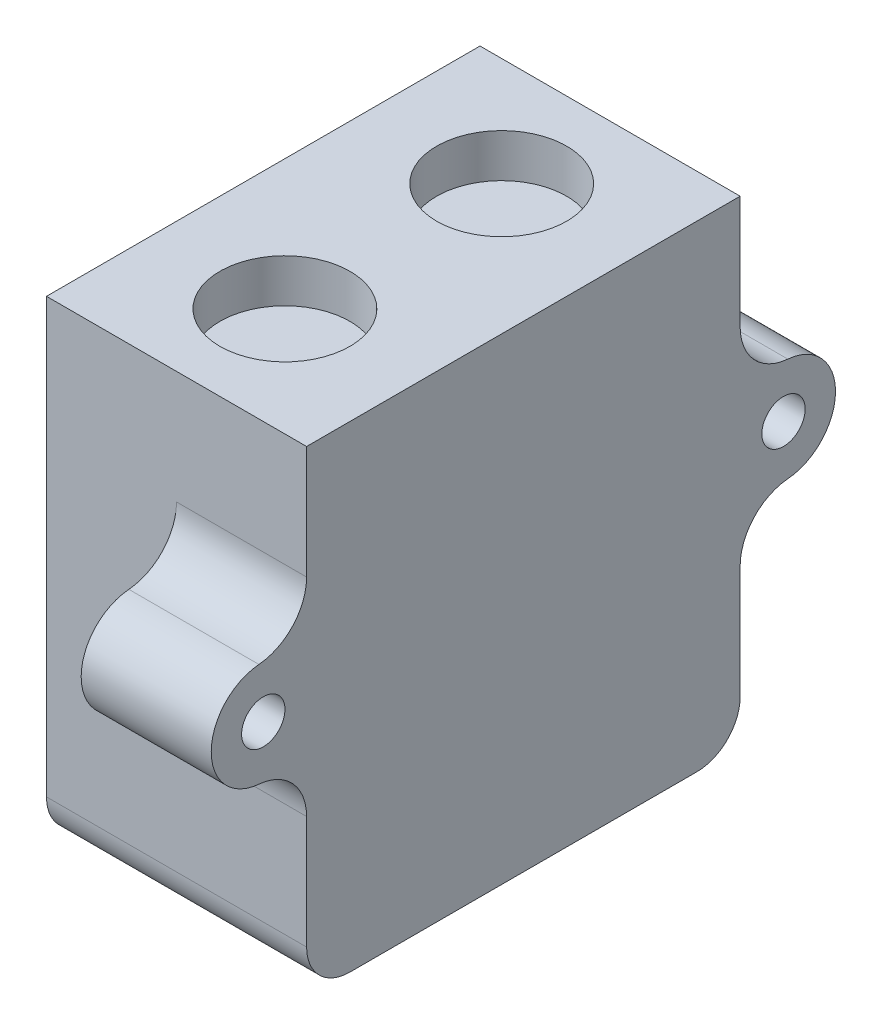
ISO-10303-21;
HEADER;
FILE_DESCRIPTION(('STEP AP214'),'2;1');
FILE_NAME('part.step','',(''),(''),'','','');
FILE_SCHEMA(('AUTOMOTIVE_DESIGN { 1 0 10303 214 1 1 1 1 }'));
ENDSEC;
DATA;
#1=APPLICATION_CONTEXT('core data for automotive mechanical design processes');
#2=APPLICATION_PROTOCOL_DEFINITION('international standard','automotive_design',2000,#1);
#3=PRODUCT_CONTEXT('',#1,'mechanical');
#4=PRODUCT('Part','Part','',(#3));
#5=PRODUCT_RELATED_PRODUCT_CATEGORY('part','',(#4));
#6=PRODUCT_DEFINITION_FORMATION('','',#4);
#7=PRODUCT_DEFINITION_CONTEXT('part definition',#1,'design');
#8=PRODUCT_DEFINITION('design','',#6,#7);
#9=PRODUCT_DEFINITION_SHAPE('','',#8);
#10=(LENGTH_UNIT() NAMED_UNIT(*) SI_UNIT(.MILLI.,.METRE.));
#11=(NAMED_UNIT(*) PLANE_ANGLE_UNIT() SI_UNIT($,.RADIAN.));
#12=(NAMED_UNIT(*) SI_UNIT($,.STERADIAN.) SOLID_ANGLE_UNIT());
#13=UNCERTAINTY_MEASURE_WITH_UNIT(LENGTH_MEASURE(1.E-05),#10,'distance_accuracy_value','');
#14=(GEOMETRIC_REPRESENTATION_CONTEXT(3) GLOBAL_UNCERTAINTY_ASSIGNED_CONTEXT((#13)) GLOBAL_UNIT_ASSIGNED_CONTEXT((#10,
#11,#12)) REPRESENTATION_CONTEXT('',''));
#15=CARTESIAN_POINT('',(0.,0.,0.));
#16=DIRECTION('',(0.,0.,1.));
#17=DIRECTION('',(1.,0.,0.));
#18=AXIS2_PLACEMENT_3D('',#15,#16,#17);
#19=CARTESIAN_POINT('',(60.,50.,50.));
#20=DIRECTION('',(0.,0.,-1.));
#21=DIRECTION('',(-1.,0.,0.));
#22=AXIS2_PLACEMENT_3D('',#19,#20,#21);
#23=PLANE('',#22);
#24=DIRECTION('',(0.,-1.,0.));
#25=VECTOR('',#24,1.);
#26=CARTESIAN_POINT('',(60.,50.,50.));
#27=LINE('',#26,#25);
#28=CARTESIAN_POINT('',(60.,-13.9165214862028,50.));
#29=VERTEX_POINT('',#28);
#30=CARTESIAN_POINT('',(60.,-40.,50.));
#31=VERTEX_POINT('',#30);
#32=EDGE_CURVE('E249',#29,#31,#27,.T.);
#33=ORIENTED_EDGE('',*,*,#32,.F.);
#34=DIRECTION('',(1.,0.,0.));
#35=VECTOR('',#34,1.);
#36=CARTESIAN_POINT('',(30.,-13.9165214862028,50.));
#37=LINE('',#36,#35);
#38=CARTESIAN_POINT('',(30.,-13.9165214862028,50.));
#39=VERTEX_POINT('',#38);
#40=EDGE_CURVE('E200',#39,#29,#37,.T.);
#41=ORIENTED_EDGE('',*,*,#40,.F.);
#42=DIRECTION('',(0.,1.,0.));
#43=VECTOR('',#42,1.);
#44=CARTESIAN_POINT('',(30.,33.9165214862028,50.));
#45=LINE('',#44,#43);
#46=CARTESIAN_POINT('',(30.,33.9165214862028,50.));
#47=VERTEX_POINT('',#46);
#48=EDGE_CURVE('E190',#39,#47,#45,.T.);
#49=ORIENTED_EDGE('',*,*,#48,.T.);
#50=DIRECTION('',(1.,0.,0.));
#51=VECTOR('',#50,1.);
#52=CARTESIAN_POINT('',(30.,33.9165214862028,50.));
#53=LINE('',#52,#51);
#54=CARTESIAN_POINT('',(60.,33.9165214862028,50.));
#55=VERTEX_POINT('',#54);
#56=EDGE_CURVE('E211',#47,#55,#53,.T.);
#57=ORIENTED_EDGE('',*,*,#56,.T.);
#58=CARTESIAN_POINT('',(60.,60.,50.));
#59=VERTEX_POINT('',#58);
#60=EDGE_CURVE('E245',#59,#55,#27,.T.);
#61=ORIENTED_EDGE('',*,*,#60,.F.);
#62=DIRECTION('',(1.,0.,0.));
#63=VECTOR('',#62,1.);
#64=CARTESIAN_POINT('',(60.,60.,50.));
#65=LINE('',#64,#63);
#66=CARTESIAN_POINT('',(0.,60.,50.));
#67=VERTEX_POINT('',#66);
#68=EDGE_CURVE('E229',#67,#59,#65,.T.);
#69=ORIENTED_EDGE('',*,*,#68,.F.);
#70=DIRECTION('',(0.,-1.,0.));
#71=VECTOR('',#70,1.);
#72=CARTESIAN_POINT('',(0.,50.,50.));
#73=LINE('',#72,#71);
#74=CARTESIAN_POINT('',(0.,-40.,50.));
#75=VERTEX_POINT('',#74);
#76=EDGE_CURVE('E242',#67,#75,#73,.T.);
#77=ORIENTED_EDGE('',*,*,#76,.T.);
#78=DIRECTION('',(-1.,0.,0.));
#79=VECTOR('',#78,1.);
#80=CARTESIAN_POINT('',(60.,-40.,50.));
#81=LINE('',#80,#79);
#82=EDGE_CURVE('E272',#75,#31,#81,.F.);
#83=ORIENTED_EDGE('',*,*,#82,.T.);
#84=EDGE_LOOP('',(#33,#41,#49,#57,#61,#69,#77,#83));
#85=FACE_BOUND('',#84,.T.);
#86=ADVANCED_FACE('F39',(#85),#23,.F.);
#87=CARTESIAN_POINT('',(60.,-50.,50.));
#88=DIRECTION('',(0.,1.,0.));
#89=DIRECTION('',(0.,0.,1.));
#90=AXIS2_PLACEMENT_3D('',#87,#88,#89);
#91=PLANE('',#90);
#92=DIRECTION('',(0.,0.,-1.));
#93=VECTOR('',#92,1.);
#94=CARTESIAN_POINT('',(60.,-50.,50.));
#95=LINE('',#94,#93);
#96=CARTESIAN_POINT('',(60.,-50.,40.));
#97=VERTEX_POINT('',#96);
#98=CARTESIAN_POINT('',(60.,-50.,-40.));
#99=VERTEX_POINT('',#98);
#100=EDGE_CURVE('E248',#97,#99,#95,.T.);
#101=ORIENTED_EDGE('',*,*,#100,.F.);
#102=DIRECTION('',(-1.,0.,0.));
#103=VECTOR('',#102,1.);
#104=CARTESIAN_POINT('',(60.,-50.,40.));
#105=LINE('',#104,#103);
#106=CARTESIAN_POINT('',(0.,-50.,40.));
#107=VERTEX_POINT('',#106);
#108=EDGE_CURVE('E265',#97,#107,#105,.T.);
#109=ORIENTED_EDGE('',*,*,#108,.T.);
#110=DIRECTION('',(0.,0.,-1.));
#111=VECTOR('',#110,1.);
#112=CARTESIAN_POINT('',(0.,-50.,50.));
#113=LINE('',#112,#111);
#114=CARTESIAN_POINT('',(0.,-50.,-40.));
#115=VERTEX_POINT('',#114);
#116=EDGE_CURVE('E259',#107,#115,#113,.T.);
#117=ORIENTED_EDGE('',*,*,#116,.T.);
#118=DIRECTION('',(-1.,0.,0.));
#119=VECTOR('',#118,1.);
#120=CARTESIAN_POINT('',(60.,-50.,-40.));
#121=LINE('',#120,#119);
#122=EDGE_CURVE('E256',#115,#99,#121,.F.);
#123=ORIENTED_EDGE('',*,*,#122,.T.);
#124=EDGE_LOOP('',(#101,#109,#117,#123));
#125=FACE_BOUND('',#124,.T.);
#126=ADVANCED_FACE('F286',(#125),#91,.F.);
#127=CARTESIAN_POINT('',(60.,50.,-50.));
#128=DIRECTION('',(0.,0.,1.));
#129=DIRECTION('',(1.,0.,0.));
#130=AXIS2_PLACEMENT_3D('',#127,#128,#129);
#131=PLANE('',#130);
#132=DIRECTION('',(0.,1.,0.));
#133=VECTOR('',#132,1.);
#134=CARTESIAN_POINT('',(30.,33.9165214862028,-50.));
#135=LINE('',#134,#133);
#136=CARTESIAN_POINT('',(30.,-13.9165214862028,-50.));
#137=VERTEX_POINT('',#136);
#138=CARTESIAN_POINT('',(30.,33.9165214862028,-50.));
#139=VERTEX_POINT('',#138);
#140=EDGE_CURVE('E159',#137,#139,#135,.T.);
#141=ORIENTED_EDGE('',*,*,#140,.F.);
#142=DIRECTION('',(1.,0.,0.));
#143=VECTOR('',#142,1.);
#144=CARTESIAN_POINT('',(30.,-13.9165214862028,-50.));
#145=LINE('',#144,#143);
#146=CARTESIAN_POINT('',(60.,-13.9165214862028,-50.));
#147=VERTEX_POINT('',#146);
#148=EDGE_CURVE('E163',#137,#147,#145,.T.);
#149=ORIENTED_EDGE('',*,*,#148,.T.);
#150=DIRECTION('',(0.,1.,0.));
#151=VECTOR('',#150,1.);
#152=CARTESIAN_POINT('',(60.,50.,-50.));
#153=LINE('',#152,#151);
#154=CARTESIAN_POINT('',(60.,-40.,-50.));
#155=VERTEX_POINT('',#154);
#156=EDGE_CURVE('E253',#155,#147,#153,.T.);
#157=ORIENTED_EDGE('',*,*,#156,.F.);
#158=DIRECTION('',(-1.,0.,0.));
#159=VECTOR('',#158,1.);
#160=CARTESIAN_POINT('',(60.,-40.,-50.));
#161=LINE('',#160,#159);
#162=CARTESIAN_POINT('',(0.,-40.,-50.));
#163=VERTEX_POINT('',#162);
#164=EDGE_CURVE('E11',#155,#163,#161,.T.);
#165=ORIENTED_EDGE('',*,*,#164,.T.);
#166=DIRECTION('',(0.,1.,0.));
#167=VECTOR('',#166,1.);
#168=CARTESIAN_POINT('',(0.,50.,-50.));
#169=LINE('',#168,#167);
#170=CARTESIAN_POINT('',(0.,60.,-50.));
#171=VERTEX_POINT('',#170);
#172=EDGE_CURVE('E262',#163,#171,#169,.T.);
#173=ORIENTED_EDGE('',*,*,#172,.T.);
#174=DIRECTION('',(-1.,0.,0.));
#175=VECTOR('',#174,1.);
#176=CARTESIAN_POINT('',(60.,60.,-50.));
#177=LINE('',#176,#175);
#178=CARTESIAN_POINT('',(60.,60.,-50.));
#179=VERTEX_POINT('',#178);
#180=EDGE_CURVE('E235',#179,#171,#177,.T.);
#181=ORIENTED_EDGE('',*,*,#180,.F.);
#182=CARTESIAN_POINT('',(60.,33.9165214862028,-50.));
#183=VERTEX_POINT('',#182);
#184=EDGE_CURVE('E252',#183,#179,#153,.T.);
#185=ORIENTED_EDGE('',*,*,#184,.F.);
#186=DIRECTION('',(1.,0.,0.));
#187=VECTOR('',#186,1.);
#188=CARTESIAN_POINT('',(30.,33.9165214862028,-50.));
#189=LINE('',#188,#187);
#190=EDGE_CURVE('E179',#139,#183,#189,.T.);
#191=ORIENTED_EDGE('',*,*,#190,.F.);
#192=EDGE_LOOP('',(#141,#149,#157,#165,#173,#181,#185,#191));
#193=FACE_BOUND('',#192,.T.);
#194=ADVANCED_FACE('F302',(#193),#131,.F.);
#195=CARTESIAN_POINT('',(60.,0.,0.));
#196=DIRECTION('',(-1.,0.,0.));
#197=DIRECTION('',(0.,0.,1.));
#198=AXIS2_PLACEMENT_3D('',#195,#196,#197);
#199=PLANE('',#198);
#200=ORIENTED_EDGE('',*,*,#60,.T.);
#201=CARTESIAN_POINT('',(60.,33.9165214862028,62.));
#202=DIRECTION('',(-1.,0.,0.));
#203=DIRECTION('',(0.,0.,-1.));
#204=AXIS2_PLACEMENT_3D('',#201,#202,#203);
#205=CIRCLE('',#204,12.);
#206=CARTESIAN_POINT('',(60.,21.9582607431014,61.));
#207=VERTEX_POINT('',#206);
#208=EDGE_CURVE('E202',#55,#207,#205,.T.);
#209=ORIENTED_EDGE('',*,*,#208,.T.);
#210=CARTESIAN_POINT('',(60.,10.,60.));
#211=DIRECTION('',(1.,0.,0.));
#212=DIRECTION('',(0.,0.,1.));
#213=AXIS2_PLACEMENT_3D('',#210,#211,#212);
#214=CIRCLE('',#213,12.);
#215=CARTESIAN_POINT('',(60.,-1.95826074310139,61.));
#216=VERTEX_POINT('',#215);
#217=EDGE_CURVE('E191',#207,#216,#214,.T.);
#218=ORIENTED_EDGE('',*,*,#217,.T.);
#219=CARTESIAN_POINT('',(60.,-13.9165214862028,62.));
#220=DIRECTION('',(-1.,0.,0.));
#221=DIRECTION('',(0.,0.,-1.));
#222=AXIS2_PLACEMENT_3D('',#219,#220,#221);
#223=CIRCLE('',#222,12.);
#224=EDGE_CURVE('E61',#216,#29,#223,.T.);
#225=ORIENTED_EDGE('',*,*,#224,.T.);
#226=ORIENTED_EDGE('',*,*,#32,.T.);
#227=CARTESIAN_POINT('',(60.,-40.,40.));
#228=DIRECTION('',(-1.,0.,0.));
#229=DIRECTION('',(0.,0.,1.));
#230=AXIS2_PLACEMENT_3D('',#227,#228,#229);
#231=CIRCLE('',#230,10.);
#232=EDGE_CURVE('E47',#31,#97,#231,.F.);
#233=ORIENTED_EDGE('',*,*,#232,.T.);
#234=ORIENTED_EDGE('',*,*,#100,.T.);
#235=CARTESIAN_POINT('',(60.,-40.,-40.));
#236=DIRECTION('',(-1.,0.,0.));
#237=DIRECTION('',(0.,0.,1.));
#238=AXIS2_PLACEMENT_3D('',#235,#236,#237);
#239=CIRCLE('',#238,10.);
#240=EDGE_CURVE('E275',#99,#155,#239,.F.);
#241=ORIENTED_EDGE('',*,*,#240,.T.);
#242=ORIENTED_EDGE('',*,*,#156,.T.);
#243=CARTESIAN_POINT('',(60.,-13.9165214862028,-62.));
#244=DIRECTION('',(1.,0.,0.));
#245=DIRECTION('',(0.,0.,1.));
#246=AXIS2_PLACEMENT_3D('',#243,#244,#245);
#247=CIRCLE('',#246,12.);
#248=CARTESIAN_POINT('',(60.,-1.95826074310139,-61.));
#249=VERTEX_POINT('',#248);
#250=EDGE_CURVE('E173',#249,#147,#247,.T.);
#251=ORIENTED_EDGE('',*,*,#250,.F.);
#252=CARTESIAN_POINT('',(60.,10.,-60.));
#253=DIRECTION('',(-1.,0.,0.));
#254=DIRECTION('',(0.,0.,-1.));
#255=AXIS2_PLACEMENT_3D('',#252,#253,#254);
#256=CIRCLE('',#255,12.);
#257=CARTESIAN_POINT('',(60.,21.9582607431014,-61.));
#258=VERTEX_POINT('',#257);
#259=EDGE_CURVE('E155',#258,#249,#256,.T.);
#260=ORIENTED_EDGE('',*,*,#259,.F.);
#261=CARTESIAN_POINT('',(60.,33.9165214862028,-62.));
#262=DIRECTION('',(1.,0.,0.));
#263=DIRECTION('',(0.,0.,1.));
#264=AXIS2_PLACEMENT_3D('',#261,#262,#263);
#265=CIRCLE('',#264,12.);
#266=EDGE_CURVE('E54',#183,#258,#265,.T.);
#267=ORIENTED_EDGE('',*,*,#266,.F.);
#268=ORIENTED_EDGE('',*,*,#184,.T.);
#269=DIRECTION('',(0.,0.,-1.));
#270=VECTOR('',#269,1.);
#271=CARTESIAN_POINT('',(60.,60.,-50.));
#272=LINE('',#271,#270);
#273=EDGE_CURVE('E232',#59,#179,#272,.T.);
#274=ORIENTED_EDGE('',*,*,#273,.F.);
#275=EDGE_LOOP('',(#200,#209,#218,#225,#226,#233,#234,#241,#242,#251,#260,#267,#268,#274));
#276=FACE_BOUND('',#275,.T.);
#277=CARTESIAN_POINT('',(60.,10.,60.));
#278=DIRECTION('',(1.,0.,0.));
#279=DIRECTION('',(0.,0.,-1.));
#280=AXIS2_PLACEMENT_3D('',#277,#278,#279);
#281=CIRCLE('',#280,5.);
#282=CARTESIAN_POINT('',(60.,10.,55.));
#283=VERTEX_POINT('',#282);
#284=EDGE_CURVE('E178',#283,#283,#281,.T.);
#285=ORIENTED_EDGE('',*,*,#284,.F.);
#286=EDGE_LOOP('',(#285));
#287=FACE_BOUND('',#286,.T.);
#288=CARTESIAN_POINT('',(60.,10.,-60.));
#289=DIRECTION('',(-1.,0.,0.));
#290=DIRECTION('',(0.,0.,1.));
#291=AXIS2_PLACEMENT_3D('',#288,#289,#290);
#292=CIRCLE('',#291,5.);
#293=CARTESIAN_POINT('',(60.,10.,-55.));
#294=VERTEX_POINT('',#293);
#295=EDGE_CURVE('E168',#294,#294,#292,.T.);
#296=ORIENTED_EDGE('',*,*,#295,.T.);
#297=EDGE_LOOP('',(#296));
#298=FACE_BOUND('',#297,.T.);
#299=ADVANCED_FACE('F278',(#276,#287,#298),#199,.F.);
#300=CARTESIAN_POINT('',(0.,0.,0.));
#301=DIRECTION('',(-1.,0.,0.));
#302=DIRECTION('',(0.,0.,1.));
#303=AXIS2_PLACEMENT_3D('',#300,#301,#302);
#304=PLANE('',#303);
#305=CARTESIAN_POINT('',(0.,0.,0.));
#306=DIRECTION('',(-1.,0.,0.));
#307=DIRECTION('',(0.,0.,1.));
#308=AXIS2_PLACEMENT_3D('',#305,#306,#307);
#309=CIRCLE('',#308,31.);
#310=CARTESIAN_POINT('',(0.,0.,31.));
#311=VERTEX_POINT('',#310);
#312=EDGE_CURVE('E238',#311,#311,#309,.T.);
#313=ORIENTED_EDGE('',*,*,#312,.F.);
#314=EDGE_LOOP('',(#313));
#315=FACE_BOUND('',#314,.T.);
#316=ORIENTED_EDGE('',*,*,#116,.F.);
#317=CARTESIAN_POINT('',(0.,-40.,40.));
#318=DIRECTION('',(-1.,0.,0.));
#319=DIRECTION('',(0.,0.,1.));
#320=AXIS2_PLACEMENT_3D('',#317,#318,#319);
#321=CIRCLE('',#320,10.);
#322=EDGE_CURVE('E270',#107,#75,#321,.T.);
#323=ORIENTED_EDGE('',*,*,#322,.T.);
#324=ORIENTED_EDGE('',*,*,#76,.F.);
#325=DIRECTION('',(0.,0.,1.));
#326=VECTOR('',#325,1.);
#327=CARTESIAN_POINT('',(0.,60.,-50.));
#328=LINE('',#327,#326);
#329=EDGE_CURVE('E224',#171,#67,#328,.T.);
#330=ORIENTED_EDGE('',*,*,#329,.F.);
#331=ORIENTED_EDGE('',*,*,#172,.F.);
#332=CARTESIAN_POINT('',(0.,-40.,-40.));
#333=DIRECTION('',(-1.,0.,0.));
#334=DIRECTION('',(0.,0.,1.));
#335=AXIS2_PLACEMENT_3D('',#332,#333,#334);
#336=CIRCLE('',#335,10.);
#337=EDGE_CURVE('E268',#163,#115,#336,.T.);
#338=ORIENTED_EDGE('',*,*,#337,.T.);
#339=EDGE_LOOP('',(#316,#323,#324,#330,#331,#338));
#340=FACE_BOUND('',#339,.T.);
#341=ADVANCED_FACE('F291',(#315,#340),#304,.T.);
#342=CARTESIAN_POINT('',(30.,0.,0.));
#343=DIRECTION('',(-1.,0.,0.));
#344=DIRECTION('',(0.,0.,1.));
#345=AXIS2_PLACEMENT_3D('',#342,#343,#344);
#346=CYLINDRICAL_SURFACE('',#345,31.);
#347=CARTESIAN_POINT('',(30.,0.,0.));
#348=DIRECTION('',(-1.,0.,0.));
#349=DIRECTION('',(0.,0.,1.));
#350=AXIS2_PLACEMENT_3D('',#347,#348,#349);
#351=CIRCLE('',#350,31.);
#352=CARTESIAN_POINT('',(30.,0.,31.));
#353=VERTEX_POINT('',#352);
#354=EDGE_CURVE('E239',#353,#353,#351,.T.);
#355=ORIENTED_EDGE('',*,*,#354,.F.);
#356=EDGE_LOOP('',(#355));
#357=FACE_BOUND('',#356,.T.);
#358=ORIENTED_EDGE('',*,*,#312,.T.);
#359=EDGE_LOOP('',(#358));
#360=FACE_BOUND('',#359,.T.);
#361=ADVANCED_FACE('F355',(#357,#360),#346,.F.);
#362=CARTESIAN_POINT('',(30.,0.,0.));
#363=DIRECTION('',(-1.,0.,0.));
#364=DIRECTION('',(0.,0.,1.));
#365=AXIS2_PLACEMENT_3D('',#362,#363,#364);
#366=PLANE('',#365);
#367=ORIENTED_EDGE('',*,*,#354,.T.);
#368=EDGE_LOOP('',(#367));
#369=FACE_BOUND('',#368,.T.);
#370=ADVANCED_FACE('F350',(#369),#366,.T.);
#371=CARTESIAN_POINT('',(60.,-40.,40.));
#372=DIRECTION('',(-1.,0.,0.));
#373=DIRECTION('',(0.,0.,1.));
#374=AXIS2_PLACEMENT_3D('',#371,#372,#373);
#375=CYLINDRICAL_SURFACE('',#374,10.);
#376=ORIENTED_EDGE('',*,*,#232,.F.);
#377=ORIENTED_EDGE('',*,*,#82,.F.);
#378=ORIENTED_EDGE('',*,*,#322,.F.);
#379=ORIENTED_EDGE('',*,*,#108,.F.);
#380=EDGE_LOOP('',(#376,#377,#378,#379));
#381=FACE_BOUND('',#380,.T.);
#382=ADVANCED_FACE('F289',(#381),#375,.T.);
#383=CARTESIAN_POINT('',(60.,-40.,-40.));
#384=DIRECTION('',(-1.,0.,0.));
#385=DIRECTION('',(0.,0.,1.));
#386=AXIS2_PLACEMENT_3D('',#383,#384,#385);
#387=CYLINDRICAL_SURFACE('',#386,10.);
#388=ORIENTED_EDGE('',*,*,#240,.F.);
#389=ORIENTED_EDGE('',*,*,#122,.F.);
#390=ORIENTED_EDGE('',*,*,#337,.F.);
#391=ORIENTED_EDGE('',*,*,#164,.F.);
#392=EDGE_LOOP('',(#388,#389,#390,#391));
#393=FACE_BOUND('',#392,.T.);
#394=ADVANCED_FACE('F41',(#393),#387,.T.);
#395=CARTESIAN_POINT('',(0.,60.,0.));
#396=DIRECTION('',(0.,-1.,0.));
#397=DIRECTION('',(0.,0.,-1.));
#398=AXIS2_PLACEMENT_3D('',#395,#396,#397);
#399=PLANE('',#398);
#400=ORIENTED_EDGE('',*,*,#329,.T.);
#401=ORIENTED_EDGE('',*,*,#68,.T.);
#402=ORIENTED_EDGE('',*,*,#273,.T.);
#403=ORIENTED_EDGE('',*,*,#180,.T.);
#404=EDGE_LOOP('',(#400,#401,#402,#403));
#405=FACE_BOUND('',#404,.T.);
#406=CARTESIAN_POINT('',(30.,60.,-25.));
#407=DIRECTION('',(0.,1.,0.));
#408=DIRECTION('',(0.,0.,1.));
#409=AXIS2_PLACEMENT_3D('',#406,#407,#408);
#410=CIRCLE('',#409,15.);
#411=CARTESIAN_POINT('',(30.,60.,-10.));
#412=VERTEX_POINT('',#411);
#413=EDGE_CURVE('E221',#412,#412,#410,.T.);
#414=ORIENTED_EDGE('',*,*,#413,.F.);
#415=EDGE_LOOP('',(#414));
#416=FACE_BOUND('',#415,.T.);
#417=CARTESIAN_POINT('',(30.,60.,25.));
#418=DIRECTION('',(0.,1.,0.));
#419=DIRECTION('',(0.,0.,1.));
#420=AXIS2_PLACEMENT_3D('',#417,#418,#419);
#421=CIRCLE('',#420,15.);
#422=CARTESIAN_POINT('',(30.,60.,40.));
#423=VERTEX_POINT('',#422);
#424=EDGE_CURVE('E215',#423,#423,#421,.T.);
#425=ORIENTED_EDGE('',*,*,#424,.F.);
#426=EDGE_LOOP('',(#425));
#427=FACE_BOUND('',#426,.T.);
#428=ADVANCED_FACE('F297',(#405,#416,#427),#399,.F.);
#429=CARTESIAN_POINT('',(30.,60.,-25.));
#430=DIRECTION('',(0.,-1.,0.));
#431=DIRECTION('',(0.,0.,-1.));
#432=AXIS2_PLACEMENT_3D('',#429,#430,#431);
#433=CYLINDRICAL_SURFACE('',#432,15.);
#434=ORIENTED_EDGE('',*,*,#413,.T.);
#435=EDGE_LOOP('',(#434));
#436=FACE_BOUND('',#435,.T.);
#437=CARTESIAN_POINT('',(30.,50.,-25.));
#438=DIRECTION('',(0.,1.,0.));
#439=DIRECTION('',(0.,0.,1.));
#440=AXIS2_PLACEMENT_3D('',#437,#438,#439);
#441=CIRCLE('',#440,15.);
#442=CARTESIAN_POINT('',(30.,50.,-10.));
#443=VERTEX_POINT('',#442);
#444=EDGE_CURVE('E218',#443,#443,#441,.T.);
#445=ORIENTED_EDGE('',*,*,#444,.F.);
#446=EDGE_LOOP('',(#445));
#447=FACE_BOUND('',#446,.T.);
#448=ADVANCED_FACE('F457',(#436,#447),#433,.F.);
#449=CARTESIAN_POINT('',(30.,60.,25.));
#450=DIRECTION('',(0.,-1.,0.));
#451=DIRECTION('',(0.,0.,-1.));
#452=AXIS2_PLACEMENT_3D('',#449,#450,#451);
#453=CYLINDRICAL_SURFACE('',#452,15.);
#454=ORIENTED_EDGE('',*,*,#424,.T.);
#455=EDGE_LOOP('',(#454));
#456=FACE_BOUND('',#455,.T.);
#457=CARTESIAN_POINT('',(30.,50.,25.));
#458=DIRECTION('',(0.,1.,0.));
#459=DIRECTION('',(0.,0.,1.));
#460=AXIS2_PLACEMENT_3D('',#457,#458,#459);
#461=CIRCLE('',#460,15.);
#462=CARTESIAN_POINT('',(30.,50.,40.));
#463=VERTEX_POINT('',#462);
#464=EDGE_CURVE('E208',#463,#463,#461,.T.);
#465=ORIENTED_EDGE('',*,*,#464,.F.);
#466=EDGE_LOOP('',(#465));
#467=FACE_BOUND('',#466,.T.);
#468=ADVANCED_FACE('F347',(#456,#467),#453,.F.);
#469=CARTESIAN_POINT('',(60.,50.,50.));
#470=DIRECTION('',(0.,-1.,0.));
#471=DIRECTION('',(0.,0.,-1.));
#472=AXIS2_PLACEMENT_3D('',#469,#470,#471);
#473=PLANE('',#472);
#474=ORIENTED_EDGE('',*,*,#444,.T.);
#475=EDGE_LOOP('',(#474));
#476=FACE_BOUND('',#475,.T.);
#477=ADVANCED_FACE('F344',(#476),#473,.F.);
#478=ORIENTED_EDGE('',*,*,#464,.T.);
#479=EDGE_LOOP('',(#478));
#480=FACE_BOUND('',#479,.T.);
#481=ADVANCED_FACE('F346',(#480),#473,.F.);
#482=CARTESIAN_POINT('',(30.,-13.9165214862028,62.));
#483=DIRECTION('',(1.,0.,0.));
#484=DIRECTION('',(0.,0.,-1.));
#485=AXIS2_PLACEMENT_3D('',#482,#483,#484);
#486=CYLINDRICAL_SURFACE('',#485,12.);
#487=ORIENTED_EDGE('',*,*,#224,.F.);
#488=DIRECTION('',(1.,0.,0.));
#489=VECTOR('',#488,1.);
#490=CARTESIAN_POINT('',(30.,-1.95826074310139,61.));
#491=LINE('',#490,#489);
#492=CARTESIAN_POINT('',(30.,-1.95826074310139,61.));
#493=VERTEX_POINT('',#492);
#494=EDGE_CURVE('E206',#493,#216,#491,.T.);
#495=ORIENTED_EDGE('',*,*,#494,.F.);
#496=CARTESIAN_POINT('',(30.,-13.9165214862028,62.));
#497=DIRECTION('',(-1.,0.,0.));
#498=DIRECTION('',(0.,0.,-1.));
#499=AXIS2_PLACEMENT_3D('',#496,#497,#498);
#500=CIRCLE('',#499,12.);
#501=EDGE_CURVE('E187',#493,#39,#500,.T.);
#502=ORIENTED_EDGE('',*,*,#501,.T.);
#503=ORIENTED_EDGE('',*,*,#40,.T.);
#504=EDGE_LOOP('',(#487,#495,#502,#503));
#505=FACE_BOUND('',#504,.T.);
#506=ADVANCED_FACE('F317',(#505),#486,.F.);
#507=CARTESIAN_POINT('',(30.,10.,60.));
#508=DIRECTION('',(1.,0.,0.));
#509=DIRECTION('',(0.,0.,-1.));
#510=AXIS2_PLACEMENT_3D('',#507,#508,#509);
#511=CYLINDRICAL_SURFACE('',#510,12.);
#512=ORIENTED_EDGE('',*,*,#217,.F.);
#513=DIRECTION('',(1.,0.,0.));
#514=VECTOR('',#513,1.);
#515=CARTESIAN_POINT('',(30.,21.9582607431014,61.));
#516=LINE('',#515,#514);
#517=CARTESIAN_POINT('',(30.,21.9582607431014,61.));
#518=VERTEX_POINT('',#517);
#519=EDGE_CURVE('E209',#518,#207,#516,.T.);
#520=ORIENTED_EDGE('',*,*,#519,.F.);
#521=CARTESIAN_POINT('',(30.,10.,60.));
#522=DIRECTION('',(1.,0.,0.));
#523=DIRECTION('',(0.,0.,1.));
#524=AXIS2_PLACEMENT_3D('',#521,#522,#523);
#525=CIRCLE('',#524,12.);
#526=EDGE_CURVE('E197',#518,#493,#525,.T.);
#527=ORIENTED_EDGE('',*,*,#526,.T.);
#528=ORIENTED_EDGE('',*,*,#494,.T.);
#529=EDGE_LOOP('',(#512,#520,#527,#528));
#530=FACE_BOUND('',#529,.T.);
#531=ADVANCED_FACE('F313',(#530),#511,.T.);
#532=CARTESIAN_POINT('',(30.,33.9165214862028,62.));
#533=DIRECTION('',(1.,0.,0.));
#534=DIRECTION('',(0.,0.,-1.));
#535=AXIS2_PLACEMENT_3D('',#532,#533,#534);
#536=CYLINDRICAL_SURFACE('',#535,12.);
#537=ORIENTED_EDGE('',*,*,#208,.F.);
#538=ORIENTED_EDGE('',*,*,#56,.F.);
#539=CARTESIAN_POINT('',(30.,33.9165214862028,62.));
#540=DIRECTION('',(-1.,0.,0.));
#541=DIRECTION('',(0.,0.,-1.));
#542=AXIS2_PLACEMENT_3D('',#539,#540,#541);
#543=CIRCLE('',#542,12.);
#544=EDGE_CURVE('E194',#47,#518,#543,.T.);
#545=ORIENTED_EDGE('',*,*,#544,.T.);
#546=ORIENTED_EDGE('',*,*,#519,.T.);
#547=EDGE_LOOP('',(#537,#538,#545,#546));
#548=FACE_BOUND('',#547,.T.);
#549=ADVANCED_FACE('F322',(#548),#536,.F.);
#550=CARTESIAN_POINT('',(30.,-13.9165214862028,62.));
#551=DIRECTION('',(1.,0.,0.));
#552=DIRECTION('',(0.,0.,-1.));
#553=AXIS2_PLACEMENT_3D('',#550,#551,#552);
#554=PLANE('',#553);
#555=CARTESIAN_POINT('',(30.,10.,60.));
#556=DIRECTION('',(1.,0.,0.));
#557=DIRECTION('',(0.,0.,-1.));
#558=AXIS2_PLACEMENT_3D('',#555,#556,#557);
#559=CIRCLE('',#558,5.);
#560=CARTESIAN_POINT('',(30.,10.,55.));
#561=VERTEX_POINT('',#560);
#562=EDGE_CURVE('E182',#561,#561,#559,.T.);
#563=ORIENTED_EDGE('',*,*,#562,.T.);
#564=EDGE_LOOP('',(#563));
#565=FACE_BOUND('',#564,.T.);
#566=ORIENTED_EDGE('',*,*,#501,.F.);
#567=ORIENTED_EDGE('',*,*,#526,.F.);
#568=ORIENTED_EDGE('',*,*,#544,.F.);
#569=ORIENTED_EDGE('',*,*,#48,.F.);
#570=EDGE_LOOP('',(#566,#567,#568,#569));
#571=FACE_BOUND('',#570,.T.);
#572=ADVANCED_FACE('F321',(#565,#571),#554,.F.);
#573=CARTESIAN_POINT('',(30.,10.,60.));
#574=DIRECTION('',(1.,0.,0.));
#575=DIRECTION('',(0.,0.,-1.));
#576=AXIS2_PLACEMENT_3D('',#573,#574,#575);
#577=CYLINDRICAL_SURFACE('',#576,5.);
#578=ORIENTED_EDGE('',*,*,#562,.F.);
#579=EDGE_LOOP('',(#578));
#580=FACE_BOUND('',#579,.T.);
#581=ORIENTED_EDGE('',*,*,#284,.T.);
#582=EDGE_LOOP('',(#581));
#583=FACE_BOUND('',#582,.T.);
#584=ADVANCED_FACE('F329',(#580,#583),#577,.F.);
#585=CARTESIAN_POINT('',(30.,-13.9165214862028,-62.));
#586=DIRECTION('',(1.,0.,0.));
#587=DIRECTION('',(0.,0.,1.));
#588=AXIS2_PLACEMENT_3D('',#585,#586,#587);
#589=PLANE('',#588);
#590=CARTESIAN_POINT('',(30.,-13.9165214862028,-62.));
#591=DIRECTION('',(1.,0.,0.));
#592=DIRECTION('',(0.,0.,1.));
#593=AXIS2_PLACEMENT_3D('',#590,#591,#592);
#594=CIRCLE('',#593,12.);
#595=CARTESIAN_POINT('',(30.,-1.95826074310139,-61.));
#596=VERTEX_POINT('',#595);
#597=EDGE_CURVE('E144',#596,#137,#594,.T.);
#598=ORIENTED_EDGE('',*,*,#597,.T.);
#599=ORIENTED_EDGE('',*,*,#140,.T.);
#600=CARTESIAN_POINT('',(30.,33.9165214862028,-62.));
#601=DIRECTION('',(1.,0.,0.));
#602=DIRECTION('',(0.,0.,1.));
#603=AXIS2_PLACEMENT_3D('',#600,#601,#602);
#604=CIRCLE('',#603,12.);
#605=CARTESIAN_POINT('',(30.,21.9582607431014,-61.));
#606=VERTEX_POINT('',#605);
#607=EDGE_CURVE('E147',#139,#606,#604,.T.);
#608=ORIENTED_EDGE('',*,*,#607,.T.);
#609=CARTESIAN_POINT('',(30.,10.,-60.));
#610=DIRECTION('',(-1.,0.,0.));
#611=DIRECTION('',(0.,0.,-1.));
#612=AXIS2_PLACEMENT_3D('',#609,#610,#611);
#613=CIRCLE('',#612,12.);
#614=EDGE_CURVE('E139',#606,#596,#613,.T.);
#615=ORIENTED_EDGE('',*,*,#614,.T.);
#616=EDGE_LOOP('',(#598,#599,#608,#615));
#617=FACE_BOUND('',#616,.T.);
#618=CARTESIAN_POINT('',(30.,10.,-60.));
#619=DIRECTION('',(-1.,0.,0.));
#620=DIRECTION('',(0.,0.,1.));
#621=AXIS2_PLACEMENT_3D('',#618,#619,#620);
#622=CIRCLE('',#621,5.);
#623=CARTESIAN_POINT('',(30.,10.,-55.));
#624=VERTEX_POINT('',#623);
#625=EDGE_CURVE('E175',#624,#624,#622,.T.);
#626=ORIENTED_EDGE('',*,*,#625,.F.);
#627=EDGE_LOOP('',(#626));
#628=FACE_BOUND('',#627,.T.);
#629=ADVANCED_FACE('F141',(#617,#628),#589,.F.);
#630=CARTESIAN_POINT('',(30.,-13.9165214862028,-62.));
#631=DIRECTION('',(1.,0.,0.));
#632=DIRECTION('',(0.,0.,-1.));
#633=AXIS2_PLACEMENT_3D('',#630,#631,#632);
#634=CYLINDRICAL_SURFACE('',#633,12.);
#635=ORIENTED_EDGE('',*,*,#250,.T.);
#636=ORIENTED_EDGE('',*,*,#148,.F.);
#637=ORIENTED_EDGE('',*,*,#597,.F.);
#638=DIRECTION('',(1.,0.,0.));
#639=VECTOR('',#638,1.);
#640=CARTESIAN_POINT('',(30.,-1.95826074310139,-61.));
#641=LINE('',#640,#639);
#642=EDGE_CURVE('E153',#596,#249,#641,.T.);
#643=ORIENTED_EDGE('',*,*,#642,.T.);
#644=EDGE_LOOP('',(#635,#636,#637,#643));
#645=FACE_BOUND('',#644,.T.);
#646=ADVANCED_FACE('F161',(#645),#634,.F.);
#647=CARTESIAN_POINT('',(30.,33.9165214862028,-62.));
#648=DIRECTION('',(1.,0.,0.));
#649=DIRECTION('',(0.,0.,-1.));
#650=AXIS2_PLACEMENT_3D('',#647,#648,#649);
#651=CYLINDRICAL_SURFACE('',#650,12.);
#652=ORIENTED_EDGE('',*,*,#266,.T.);
#653=DIRECTION('',(1.,0.,0.));
#654=VECTOR('',#653,1.);
#655=CARTESIAN_POINT('',(30.,21.9582607431014,-61.));
#656=LINE('',#655,#654);
#657=EDGE_CURVE('E158',#606,#258,#656,.T.);
#658=ORIENTED_EDGE('',*,*,#657,.F.);
#659=ORIENTED_EDGE('',*,*,#607,.F.);
#660=ORIENTED_EDGE('',*,*,#190,.T.);
#661=EDGE_LOOP('',(#652,#658,#659,#660));
#662=FACE_BOUND('',#661,.T.);
#663=ADVANCED_FACE('F309',(#662),#651,.F.);
#664=CARTESIAN_POINT('',(30.,10.,-60.));
#665=DIRECTION('',(1.,0.,0.));
#666=DIRECTION('',(0.,0.,-1.));
#667=AXIS2_PLACEMENT_3D('',#664,#665,#666);
#668=CYLINDRICAL_SURFACE('',#667,12.);
#669=ORIENTED_EDGE('',*,*,#259,.T.);
#670=ORIENTED_EDGE('',*,*,#642,.F.);
#671=ORIENTED_EDGE('',*,*,#614,.F.);
#672=ORIENTED_EDGE('',*,*,#657,.T.);
#673=EDGE_LOOP('',(#669,#670,#671,#672));
#674=FACE_BOUND('',#673,.T.);
#675=ADVANCED_FACE('F154',(#674),#668,.T.);
#676=CARTESIAN_POINT('',(30.,10.,-60.));
#677=DIRECTION('',(1.,0.,0.));
#678=DIRECTION('',(0.,0.,-1.));
#679=AXIS2_PLACEMENT_3D('',#676,#677,#678);
#680=CYLINDRICAL_SURFACE('',#679,5.);
#681=ORIENTED_EDGE('',*,*,#625,.T.);
#682=EDGE_LOOP('',(#681));
#683=FACE_BOUND('',#682,.T.);
#684=ORIENTED_EDGE('',*,*,#295,.F.);
#685=EDGE_LOOP('',(#684));
#686=FACE_BOUND('',#685,.T.);
#687=ADVANCED_FACE('F410',(#683,#686),#680,.F.);
#688=CLOSED_SHELL('',(#86,#126,#194,#299,#341,#361,#370,#382,#394,#428,#448,#468,#477,#481,#506,
#531,#549,#572,#584,#629,#646,#663,#675,#687));
#689=MANIFOLD_SOLID_BREP('B2',#688);
#690=ADVANCED_BREP_SHAPE_REPRESENTATION('',(#18,#689),#14);
#691=SHAPE_DEFINITION_REPRESENTATION(#9,#690);
ENDSEC;
END-ISO-10303-21;
